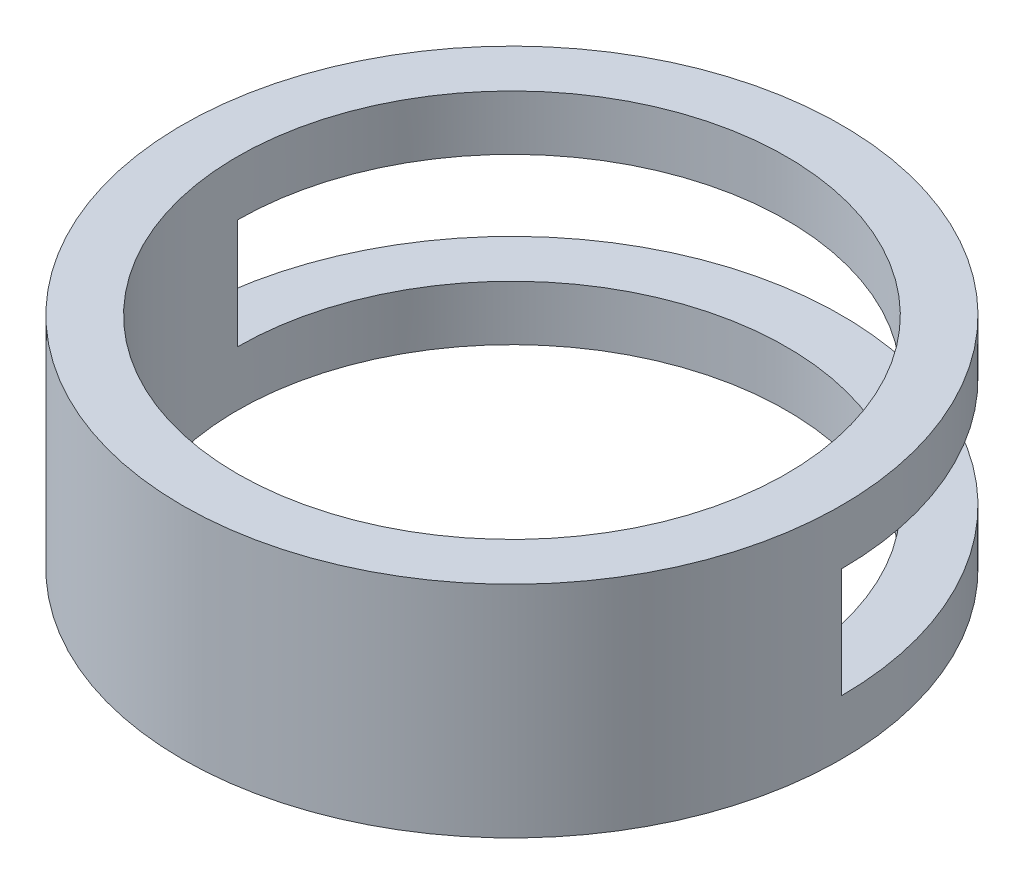
ISO-10303-21;
HEADER;
FILE_DESCRIPTION(('STEP AP214'),'2;1');
FILE_NAME('part.step','',(''),(''),'','','');
FILE_SCHEMA(('AUTOMOTIVE_DESIGN { 1 0 10303 214 1 1 1 1 }'));
ENDSEC;
DATA;
#1=APPLICATION_CONTEXT('core data for automotive mechanical design processes');
#2=APPLICATION_PROTOCOL_DEFINITION('international standard','automotive_design',2000,#1);
#3=PRODUCT_CONTEXT('',#1,'mechanical');
#4=PRODUCT('Part','Part','',(#3));
#5=PRODUCT_RELATED_PRODUCT_CATEGORY('part','',(#4));
#6=PRODUCT_DEFINITION_FORMATION('','',#4);
#7=PRODUCT_DEFINITION_CONTEXT('part definition',#1,'design');
#8=PRODUCT_DEFINITION('design','',#6,#7);
#9=PRODUCT_DEFINITION_SHAPE('','',#8);
#10=(LENGTH_UNIT() NAMED_UNIT(*) SI_UNIT(.MILLI.,.METRE.));
#11=(NAMED_UNIT(*) PLANE_ANGLE_UNIT() SI_UNIT($,.RADIAN.));
#12=(NAMED_UNIT(*) SI_UNIT($,.STERADIAN.) SOLID_ANGLE_UNIT());
#13=UNCERTAINTY_MEASURE_WITH_UNIT(LENGTH_MEASURE(1.E-05),#10,'distance_accuracy_value','');
#14=(GEOMETRIC_REPRESENTATION_CONTEXT(3) GLOBAL_UNCERTAINTY_ASSIGNED_CONTEXT((#13)) GLOBAL_UNIT_ASSIGNED_CONTEXT((#10,
#11,#12)) REPRESENTATION_CONTEXT('',''));
#15=CARTESIAN_POINT('',(0.,0.,0.));
#16=DIRECTION('',(0.,0.,1.));
#17=DIRECTION('',(1.,0.,0.));
#18=AXIS2_PLACEMENT_3D('',#15,#16,#17);
#19=CARTESIAN_POINT('',(0.,10.,0.));
#20=DIRECTION('',(0.,-1.,0.));
#21=DIRECTION('',(0.,0.,-1.));
#22=AXIS2_PLACEMENT_3D('',#19,#20,#21);
#23=CYLINDRICAL_SURFACE('',#22,30.);
#24=CARTESIAN_POINT('',(0.,-10.,0.));
#25=DIRECTION('',(0.,1.,0.));
#26=DIRECTION('',(0.,0.,1.));
#27=AXIS2_PLACEMENT_3D('',#24,#25,#26);
#28=CIRCLE('',#27,30.);
#29=CARTESIAN_POINT('',(0.,-10.,30.));
#30=VERTEX_POINT('',#29);
#31=EDGE_CURVE('E40',#30,#30,#28,.T.);
#32=ORIENTED_EDGE('',*,*,#31,.T.);
#33=EDGE_LOOP('',(#32));
#34=FACE_BOUND('',#33,.T.);
#35=CARTESIAN_POINT('',(0.,10.,0.));
#36=DIRECTION('',(0.,1.,0.));
#37=DIRECTION('',(0.,0.,1.));
#38=AXIS2_PLACEMENT_3D('',#35,#36,#37);
#39=CIRCLE('',#38,30.);
#40=CARTESIAN_POINT('',(0.,10.,30.));
#41=VERTEX_POINT('',#40);
#42=EDGE_CURVE('E11',#41,#41,#39,.T.);
#43=ORIENTED_EDGE('',*,*,#42,.F.);
#44=EDGE_LOOP('',(#43));
#45=FACE_BOUND('',#44,.T.);
#46=CARTESIAN_POINT('',(0.,-5.,0.));
#47=DIRECTION('',(0.,1.,0.));
#48=DIRECTION('',(0.,0.,1.));
#49=AXIS2_PLACEMENT_3D('',#46,#47,#48);
#50=CIRCLE('',#49,30.);
#51=CARTESIAN_POINT('',(30.,-5.,0.));
#52=VERTEX_POINT('',#51);
#53=CARTESIAN_POINT('',(-30.,-5.,0.));
#54=VERTEX_POINT('',#53);
#55=EDGE_CURVE('E91',#52,#54,#50,.T.);
#56=ORIENTED_EDGE('',*,*,#55,.F.);
#57=DIRECTION('',(0.,1.,0.));
#58=VECTOR('',#57,1.);
#59=CARTESIAN_POINT('',(30.,-5.,0.));
#60=LINE('',#59,#58);
#61=CARTESIAN_POINT('',(30.,5.,0.));
#62=VERTEX_POINT('',#61);
#63=EDGE_CURVE('E76',#52,#62,#60,.T.);
#64=ORIENTED_EDGE('',*,*,#63,.T.);
#65=CARTESIAN_POINT('',(0.,5.,0.));
#66=DIRECTION('',(0.,1.,0.));
#67=DIRECTION('',(0.,0.,1.));
#68=AXIS2_PLACEMENT_3D('',#65,#66,#67);
#69=CIRCLE('',#68,30.);
#70=CARTESIAN_POINT('',(-30.,5.,0.));
#71=VERTEX_POINT('',#70);
#72=EDGE_CURVE('E102',#62,#71,#69,.T.);
#73=ORIENTED_EDGE('',*,*,#72,.T.);
#74=DIRECTION('',(0.,1.,0.));
#75=VECTOR('',#74,1.);
#76=CARTESIAN_POINT('',(-30.,-5.,0.));
#77=LINE('',#76,#75);
#78=EDGE_CURVE('E84',#54,#71,#77,.T.);
#79=ORIENTED_EDGE('',*,*,#78,.F.);
#80=EDGE_LOOP('',(#56,#64,#73,#79));
#81=FACE_BOUND('',#80,.T.);
#82=ADVANCED_FACE('F37',(#34,#45,#81),#23,.T.);
#83=CARTESIAN_POINT('',(0.,10.,0.));
#84=DIRECTION('',(0.,-1.,0.));
#85=DIRECTION('',(0.,0.,-1.));
#86=AXIS2_PLACEMENT_3D('',#83,#84,#85);
#87=CYLINDRICAL_SURFACE('',#86,25.);
#88=CARTESIAN_POINT('',(0.,10.,0.));
#89=DIRECTION('',(0.,1.,0.));
#90=DIRECTION('',(0.,0.,1.));
#91=AXIS2_PLACEMENT_3D('',#88,#89,#90);
#92=CIRCLE('',#91,25.);
#93=CARTESIAN_POINT('',(0.,10.,25.));
#94=VERTEX_POINT('',#93);
#95=EDGE_CURVE('E113',#94,#94,#92,.T.);
#96=ORIENTED_EDGE('',*,*,#95,.T.);
#97=EDGE_LOOP('',(#96));
#98=FACE_BOUND('',#97,.T.);
#99=CARTESIAN_POINT('',(0.,-10.,0.));
#100=DIRECTION('',(0.,1.,0.));
#101=DIRECTION('',(0.,0.,1.));
#102=AXIS2_PLACEMENT_3D('',#99,#100,#101);
#103=CIRCLE('',#102,25.);
#104=CARTESIAN_POINT('',(0.,-10.,25.));
#105=VERTEX_POINT('',#104);
#106=EDGE_CURVE('E108',#105,#105,#103,.T.);
#107=ORIENTED_EDGE('',*,*,#106,.F.);
#108=EDGE_LOOP('',(#107));
#109=FACE_BOUND('',#108,.T.);
#110=DIRECTION('',(0.,1.,0.));
#111=VECTOR('',#110,1.);
#112=CARTESIAN_POINT('',(25.,-5.,0.));
#113=LINE('',#112,#111);
#114=CARTESIAN_POINT('',(25.,-5.,0.));
#115=VERTEX_POINT('',#114);
#116=CARTESIAN_POINT('',(25.,5.,0.));
#117=VERTEX_POINT('',#116);
#118=EDGE_CURVE('E106',#115,#117,#113,.T.);
#119=ORIENTED_EDGE('',*,*,#118,.F.);
#120=CARTESIAN_POINT('',(0.,-5.,0.));
#121=DIRECTION('',(0.,1.,0.));
#122=DIRECTION('',(0.,0.,1.));
#123=AXIS2_PLACEMENT_3D('',#120,#121,#122);
#124=CIRCLE('',#123,25.);
#125=CARTESIAN_POINT('',(-25.,-5.,0.));
#126=VERTEX_POINT('',#125);
#127=EDGE_CURVE('E85',#115,#126,#124,.T.);
#128=ORIENTED_EDGE('',*,*,#127,.T.);
#129=DIRECTION('',(0.,1.,0.));
#130=VECTOR('',#129,1.);
#131=CARTESIAN_POINT('',(-25.,-5.,0.));
#132=LINE('',#131,#130);
#133=CARTESIAN_POINT('',(-25.,5.,0.));
#134=VERTEX_POINT('',#133);
#135=EDGE_CURVE('E109',#126,#134,#132,.T.);
#136=ORIENTED_EDGE('',*,*,#135,.T.);
#137=CARTESIAN_POINT('',(0.,5.,0.));
#138=DIRECTION('',(0.,1.,0.));
#139=DIRECTION('',(0.,0.,1.));
#140=AXIS2_PLACEMENT_3D('',#137,#138,#139);
#141=CIRCLE('',#140,25.);
#142=EDGE_CURVE('E94',#117,#134,#141,.T.);
#143=ORIENTED_EDGE('',*,*,#142,.F.);
#144=EDGE_LOOP('',(#119,#128,#136,#143));
#145=FACE_BOUND('',#144,.T.);
#146=ADVANCED_FACE('F121',(#98,#109,#145),#87,.F.);
#147=CARTESIAN_POINT('',(0.,10.,0.));
#148=DIRECTION('',(0.,1.,0.));
#149=DIRECTION('',(0.,0.,1.));
#150=AXIS2_PLACEMENT_3D('',#147,#148,#149);
#151=PLANE('',#150);
#152=ORIENTED_EDGE('',*,*,#42,.T.);
#153=EDGE_LOOP('',(#152));
#154=FACE_BOUND('',#153,.T.);
#155=ORIENTED_EDGE('',*,*,#95,.F.);
#156=EDGE_LOOP('',(#155));
#157=FACE_BOUND('',#156,.T.);
#158=ADVANCED_FACE('F124',(#154,#157),#151,.T.);
#159=CARTESIAN_POINT('',(0.,-10.,0.));
#160=DIRECTION('',(0.,1.,0.));
#161=DIRECTION('',(0.,0.,1.));
#162=AXIS2_PLACEMENT_3D('',#159,#160,#161);
#163=PLANE('',#162);
#164=ORIENTED_EDGE('',*,*,#31,.F.);
#165=EDGE_LOOP('',(#164));
#166=FACE_BOUND('',#165,.T.);
#167=ORIENTED_EDGE('',*,*,#106,.T.);
#168=EDGE_LOOP('',(#167));
#169=FACE_BOUND('',#168,.T.);
#170=ADVANCED_FACE('F119',(#166,#169),#163,.F.);
#171=CARTESIAN_POINT('',(0.,-5.,0.));
#172=DIRECTION('',(0.,0.,1.));
#173=DIRECTION('',(1.,0.,0.));
#174=AXIS2_PLACEMENT_3D('',#171,#172,#173);
#175=PLANE('',#174);
#176=DIRECTION('',(1.,0.,0.));
#177=VECTOR('',#176,1.);
#178=CARTESIAN_POINT('',(0.,5.,0.));
#179=LINE('',#178,#177);
#180=EDGE_CURVE('E56',#117,#62,#179,.T.);
#181=ORIENTED_EDGE('',*,*,#180,.T.);
#182=ORIENTED_EDGE('',*,*,#63,.F.);
#183=DIRECTION('',(1.,0.,0.));
#184=VECTOR('',#183,1.);
#185=CARTESIAN_POINT('',(0.,-5.,0.));
#186=LINE('',#185,#184);
#187=EDGE_CURVE('E79',#115,#52,#186,.T.);
#188=ORIENTED_EDGE('',*,*,#187,.F.);
#189=ORIENTED_EDGE('',*,*,#118,.T.);
#190=EDGE_LOOP('',(#181,#182,#188,#189));
#191=FACE_BOUND('',#190,.T.);
#192=ADVANCED_FACE('F78',(#191),#175,.F.);
#193=CARTESIAN_POINT('',(0.,-5.,0.));
#194=DIRECTION('',(0.,0.,-1.));
#195=DIRECTION('',(-1.,0.,0.));
#196=AXIS2_PLACEMENT_3D('',#193,#194,#195);
#197=PLANE('',#196);
#198=DIRECTION('',(-1.,0.,0.));
#199=VECTOR('',#198,1.);
#200=CARTESIAN_POINT('',(0.,5.,0.));
#201=LINE('',#200,#199);
#202=EDGE_CURVE('E51',#134,#71,#201,.T.);
#203=ORIENTED_EDGE('',*,*,#202,.F.);
#204=ORIENTED_EDGE('',*,*,#135,.F.);
#205=DIRECTION('',(-1.,0.,0.));
#206=VECTOR('',#205,1.);
#207=CARTESIAN_POINT('',(0.,-5.,0.));
#208=LINE('',#207,#206);
#209=EDGE_CURVE('E96',#126,#54,#208,.T.);
#210=ORIENTED_EDGE('',*,*,#209,.T.);
#211=ORIENTED_EDGE('',*,*,#78,.T.);
#212=EDGE_LOOP('',(#203,#204,#210,#211));
#213=FACE_BOUND('',#212,.T.);
#214=ADVANCED_FACE('F130',(#213),#197,.T.);
#215=CARTESIAN_POINT('',(0.,-5.,0.));
#216=DIRECTION('',(0.,1.,0.));
#217=DIRECTION('',(0.,0.,1.));
#218=AXIS2_PLACEMENT_3D('',#215,#216,#217);
#219=PLANE('',#218);
#220=ORIENTED_EDGE('',*,*,#187,.T.);
#221=ORIENTED_EDGE('',*,*,#55,.T.);
#222=ORIENTED_EDGE('',*,*,#209,.F.);
#223=ORIENTED_EDGE('',*,*,#127,.F.);
#224=EDGE_LOOP('',(#220,#221,#222,#223));
#225=FACE_BOUND('',#224,.T.);
#226=ADVANCED_FACE('F89',(#225),#219,.T.);
#227=CARTESIAN_POINT('',(0.,5.,0.));
#228=DIRECTION('',(0.,1.,0.));
#229=DIRECTION('',(0.,0.,1.));
#230=AXIS2_PLACEMENT_3D('',#227,#228,#229);
#231=PLANE('',#230);
#232=ORIENTED_EDGE('',*,*,#180,.F.);
#233=ORIENTED_EDGE('',*,*,#142,.T.);
#234=ORIENTED_EDGE('',*,*,#202,.T.);
#235=ORIENTED_EDGE('',*,*,#72,.F.);
#236=EDGE_LOOP('',(#232,#233,#234,#235));
#237=FACE_BOUND('',#236,.T.);
#238=ADVANCED_FACE('F128',(#237),#231,.F.);
#239=CLOSED_SHELL('',(#82,#146,#158,#170,#192,#214,#226,#238));
#240=MANIFOLD_SOLID_BREP('B2',#239);
#241=ADVANCED_BREP_SHAPE_REPRESENTATION('',(#18,#240),#14);
#242=SHAPE_DEFINITION_REPRESENTATION(#9,#241);
ENDSEC;
END-ISO-10303-21;
